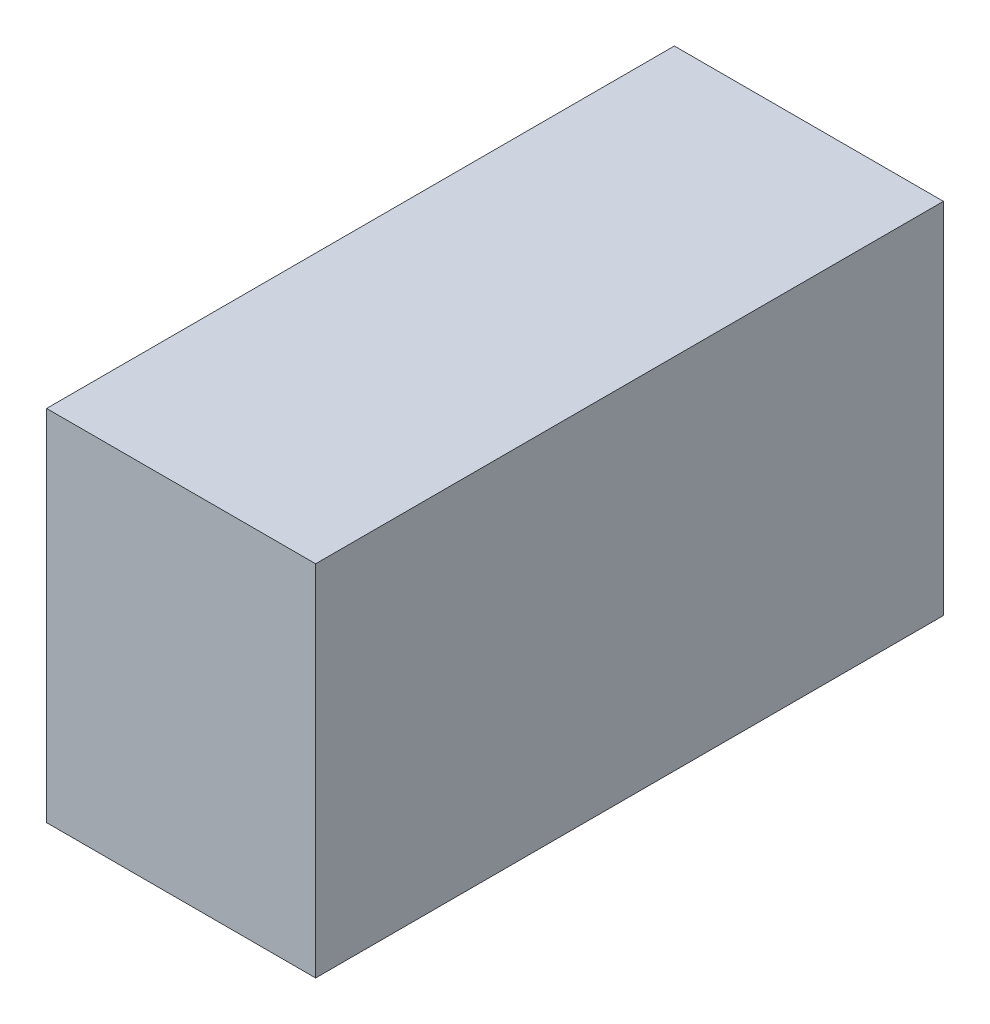
ISO-10303-21;
HEADER;
FILE_DESCRIPTION(('STEP AP214'),'2;1');
FILE_NAME('part.step','',(''),(''),'','','');
FILE_SCHEMA(('AUTOMOTIVE_DESIGN { 1 0 10303 214 1 1 1 1 }'));
ENDSEC;
DATA;
#1=APPLICATION_CONTEXT('core data for automotive mechanical design processes');
#2=APPLICATION_PROTOCOL_DEFINITION('international standard','automotive_design',2000,#1);
#3=PRODUCT_CONTEXT('',#1,'mechanical');
#4=PRODUCT('Part','Part','',(#3));
#5=PRODUCT_RELATED_PRODUCT_CATEGORY('part','',(#4));
#6=PRODUCT_DEFINITION_FORMATION('','',#4);
#7=PRODUCT_DEFINITION_CONTEXT('part definition',#1,'design');
#8=PRODUCT_DEFINITION('design','',#6,#7);
#9=PRODUCT_DEFINITION_SHAPE('','',#8);
#10=(LENGTH_UNIT() NAMED_UNIT(*) SI_UNIT(.MILLI.,.METRE.));
#11=(NAMED_UNIT(*) PLANE_ANGLE_UNIT() SI_UNIT($,.RADIAN.));
#12=(NAMED_UNIT(*) SI_UNIT($,.STERADIAN.) SOLID_ANGLE_UNIT());
#13=UNCERTAINTY_MEASURE_WITH_UNIT(LENGTH_MEASURE(1.E-05),#10,'distance_accuracy_value','');
#14=(GEOMETRIC_REPRESENTATION_CONTEXT(3) GLOBAL_UNCERTAINTY_ASSIGNED_CONTEXT((#13)) GLOBAL_UNIT_ASSIGNED_CONTEXT((#10,
#11,#12)) REPRESENTATION_CONTEXT('',''));
#15=CARTESIAN_POINT('',(0.,0.,0.));
#16=DIRECTION('',(0.,0.,1.));
#17=DIRECTION('',(1.,0.,0.));
#18=AXIS2_PLACEMENT_3D('',#15,#16,#17);
#19=CARTESIAN_POINT('',(0.,50.8,0.));
#20=DIRECTION('',(1.,0.,0.));
#21=DIRECTION('',(0.,0.,-1.));
#22=AXIS2_PLACEMENT_3D('',#19,#20,#21);
#23=PLANE('',#22);
#24=DIRECTION('',(0.,0.,1.));
#25=VECTOR('',#24,1.);
#26=CARTESIAN_POINT('',(0.,0.,0.));
#27=LINE('',#26,#25);
#28=CARTESIAN_POINT('',(0.,0.,-88.9));
#29=VERTEX_POINT('',#28);
#30=CARTESIAN_POINT('',(0.,0.,0.));
#31=VERTEX_POINT('',#30);
#32=EDGE_CURVE('E107',#29,#31,#27,.T.);
#33=ORIENTED_EDGE('',*,*,#32,.T.);
#34=DIRECTION('',(0.,-1.,0.));
#35=VECTOR('',#34,1.);
#36=CARTESIAN_POINT('',(0.,50.8,0.));
#37=LINE('',#36,#35);
#38=CARTESIAN_POINT('',(0.,50.8,0.));
#39=VERTEX_POINT('',#38);
#40=EDGE_CURVE('E11',#39,#31,#37,.T.);
#41=ORIENTED_EDGE('',*,*,#40,.F.);
#42=DIRECTION('',(0.,0.,1.));
#43=VECTOR('',#42,1.);
#44=CARTESIAN_POINT('',(0.,50.8,0.));
#45=LINE('',#44,#43);
#46=CARTESIAN_POINT('',(0.,50.8,-88.9));
#47=VERTEX_POINT('',#46);
#48=EDGE_CURVE('E91',#47,#39,#45,.T.);
#49=ORIENTED_EDGE('',*,*,#48,.F.);
#50=DIRECTION('',(0.,-1.,0.));
#51=VECTOR('',#50,1.);
#52=CARTESIAN_POINT('',(0.,50.8,-88.9));
#53=LINE('',#52,#51);
#54=EDGE_CURVE('E103',#47,#29,#53,.T.);
#55=ORIENTED_EDGE('',*,*,#54,.T.);
#56=EDGE_LOOP('',(#33,#41,#49,#55));
#57=FACE_BOUND('',#56,.T.);
#58=ADVANCED_FACE('F39',(#57),#23,.F.);
#59=CARTESIAN_POINT('',(0.,50.8,0.));
#60=DIRECTION('',(0.,0.,-1.));
#61=DIRECTION('',(-1.,0.,0.));
#62=AXIS2_PLACEMENT_3D('',#59,#60,#61);
#63=PLANE('',#62);
#64=DIRECTION('',(1.,0.,0.));
#65=VECTOR('',#64,1.);
#66=CARTESIAN_POINT('',(0.,0.,0.));
#67=LINE('',#66,#65);
#68=CARTESIAN_POINT('',(38.1,0.,0.));
#69=VERTEX_POINT('',#68);
#70=EDGE_CURVE('E96',#31,#69,#67,.T.);
#71=ORIENTED_EDGE('',*,*,#70,.T.);
#72=DIRECTION('',(0.,-1.,0.));
#73=VECTOR('',#72,1.);
#74=CARTESIAN_POINT('',(38.1,50.8,0.));
#75=LINE('',#74,#73);
#76=CARTESIAN_POINT('',(38.1,50.8,0.));
#77=VERTEX_POINT('',#76);
#78=EDGE_CURVE('E48',#77,#69,#75,.T.);
#79=ORIENTED_EDGE('',*,*,#78,.F.);
#80=DIRECTION('',(1.,0.,0.));
#81=VECTOR('',#80,1.);
#82=CARTESIAN_POINT('',(0.,50.8,0.));
#83=LINE('',#82,#81);
#84=EDGE_CURVE('E86',#39,#77,#83,.T.);
#85=ORIENTED_EDGE('',*,*,#84,.F.);
#86=ORIENTED_EDGE('',*,*,#40,.T.);
#87=EDGE_LOOP('',(#71,#79,#85,#86));
#88=FACE_BOUND('',#87,.T.);
#89=ADVANCED_FACE('F95',(#88),#63,.F.);
#90=CARTESIAN_POINT('',(38.1,50.8,0.));
#91=DIRECTION('',(-1.,0.,0.));
#92=DIRECTION('',(0.,0.,1.));
#93=AXIS2_PLACEMENT_3D('',#90,#91,#92);
#94=PLANE('',#93);
#95=DIRECTION('',(0.,0.,-1.));
#96=VECTOR('',#95,1.);
#97=CARTESIAN_POINT('',(38.1,0.,0.));
#98=LINE('',#97,#96);
#99=CARTESIAN_POINT('',(38.1,0.,-88.9));
#100=VERTEX_POINT('',#99);
#101=EDGE_CURVE('E73',#69,#100,#98,.T.);
#102=ORIENTED_EDGE('',*,*,#101,.T.);
#103=DIRECTION('',(0.,-1.,0.));
#104=VECTOR('',#103,1.);
#105=CARTESIAN_POINT('',(38.1,50.8,-88.9));
#106=LINE('',#105,#104);
#107=CARTESIAN_POINT('',(38.1,50.8,-88.9));
#108=VERTEX_POINT('',#107);
#109=EDGE_CURVE('E98',#108,#100,#106,.T.);
#110=ORIENTED_EDGE('',*,*,#109,.F.);
#111=DIRECTION('',(0.,0.,-1.));
#112=VECTOR('',#111,1.);
#113=CARTESIAN_POINT('',(38.1,50.8,0.));
#114=LINE('',#113,#112);
#115=EDGE_CURVE('E89',#77,#108,#114,.T.);
#116=ORIENTED_EDGE('',*,*,#115,.F.);
#117=ORIENTED_EDGE('',*,*,#78,.T.);
#118=EDGE_LOOP('',(#102,#110,#116,#117));
#119=FACE_BOUND('',#118,.T.);
#120=ADVANCED_FACE('F99',(#119),#94,.F.);
#121=CARTESIAN_POINT('',(0.,50.8,-88.9));
#122=DIRECTION('',(0.,0.,1.));
#123=DIRECTION('',(1.,0.,0.));
#124=AXIS2_PLACEMENT_3D('',#121,#122,#123);
#125=PLANE('',#124);
#126=DIRECTION('',(-1.,0.,0.));
#127=VECTOR('',#126,1.);
#128=CARTESIAN_POINT('',(0.,0.,-88.9));
#129=LINE('',#128,#127);
#130=EDGE_CURVE('E79',#100,#29,#129,.T.);
#131=ORIENTED_EDGE('',*,*,#130,.T.);
#132=ORIENTED_EDGE('',*,*,#54,.F.);
#133=DIRECTION('',(-1.,0.,0.));
#134=VECTOR('',#133,1.);
#135=CARTESIAN_POINT('',(0.,50.8,-88.9));
#136=LINE('',#135,#134);
#137=EDGE_CURVE('E56',#108,#47,#136,.T.);
#138=ORIENTED_EDGE('',*,*,#137,.F.);
#139=ORIENTED_EDGE('',*,*,#109,.T.);
#140=EDGE_LOOP('',(#131,#132,#138,#139));
#141=FACE_BOUND('',#140,.T.);
#142=ADVANCED_FACE('F120',(#141),#125,.F.);
#143=CARTESIAN_POINT('',(0.,50.8,0.));
#144=DIRECTION('',(0.,-1.,0.));
#145=DIRECTION('',(0.,0.,-1.));
#146=AXIS2_PLACEMENT_3D('',#143,#144,#145);
#147=PLANE('',#146);
#148=ORIENTED_EDGE('',*,*,#48,.T.);
#149=ORIENTED_EDGE('',*,*,#84,.T.);
#150=ORIENTED_EDGE('',*,*,#115,.T.);
#151=ORIENTED_EDGE('',*,*,#137,.T.);
#152=EDGE_LOOP('',(#148,#149,#150,#151));
#153=FACE_BOUND('',#152,.T.);
#154=ADVANCED_FACE('F87',(#153),#147,.F.);
#155=CARTESIAN_POINT('',(0.,0.,0.));
#156=DIRECTION('',(0.,-1.,0.));
#157=DIRECTION('',(0.,0.,-1.));
#158=AXIS2_PLACEMENT_3D('',#155,#156,#157);
#159=PLANE('',#158);
#160=ORIENTED_EDGE('',*,*,#32,.F.);
#161=ORIENTED_EDGE('',*,*,#130,.F.);
#162=ORIENTED_EDGE('',*,*,#101,.F.);
#163=ORIENTED_EDGE('',*,*,#70,.F.);
#164=EDGE_LOOP('',(#160,#161,#162,#163));
#165=FACE_BOUND('',#164,.T.);
#166=ADVANCED_FACE('F123',(#165),#159,.T.);
#167=CLOSED_SHELL('',(#58,#89,#120,#142,#154,#166));
#168=MANIFOLD_SOLID_BREP('B2',#167);
#169=ADVANCED_BREP_SHAPE_REPRESENTATION('',(#18,#168),#14);
#170=SHAPE_DEFINITION_REPRESENTATION(#9,#169);
ENDSEC;
END-ISO-10303-21;
